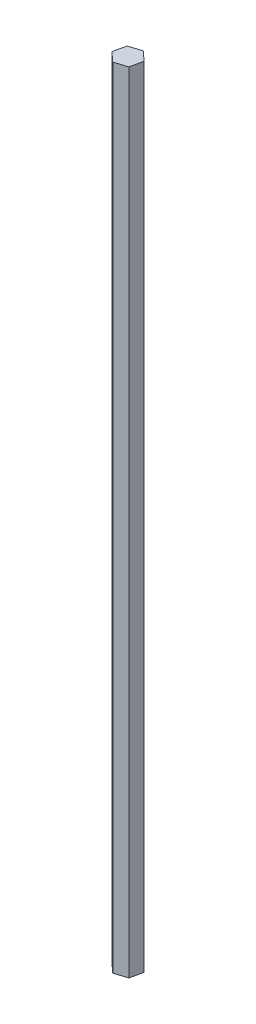
ISO-10303-21;
HEADER;
FILE_DESCRIPTION(('STEP AP214'),'2;1');
FILE_NAME('part.step','',(''),(''),'','','');
FILE_SCHEMA(('AUTOMOTIVE_DESIGN { 1 0 10303 214 1 1 1 1 }'));
ENDSEC;
DATA;
#1=APPLICATION_CONTEXT('core data for automotive mechanical design processes');
#2=APPLICATION_PROTOCOL_DEFINITION('international standard','automotive_design',2000,#1);
#3=PRODUCT_CONTEXT('',#1,'mechanical');
#4=PRODUCT('Part','Part','',(#3));
#5=PRODUCT_RELATED_PRODUCT_CATEGORY('part','',(#4));
#6=PRODUCT_DEFINITION_FORMATION('','',#4);
#7=PRODUCT_DEFINITION_CONTEXT('part definition',#1,'design');
#8=PRODUCT_DEFINITION('design','',#6,#7);
#9=PRODUCT_DEFINITION_SHAPE('','',#8);
#10=(LENGTH_UNIT() NAMED_UNIT(*) SI_UNIT(.MILLI.,.METRE.));
#11=(NAMED_UNIT(*) PLANE_ANGLE_UNIT() SI_UNIT($,.RADIAN.));
#12=(NAMED_UNIT(*) SI_UNIT($,.STERADIAN.) SOLID_ANGLE_UNIT());
#13=UNCERTAINTY_MEASURE_WITH_UNIT(LENGTH_MEASURE(1.E-05),#10,'distance_accuracy_value','');
#14=(GEOMETRIC_REPRESENTATION_CONTEXT(3) GLOBAL_UNCERTAINTY_ASSIGNED_CONTEXT((#13)) GLOBAL_UNIT_ASSIGNED_CONTEXT((#10,
#11,#12)) REPRESENTATION_CONTEXT('',''));
#15=CARTESIAN_POINT('',(0.,0.,0.));
#16=DIRECTION('',(0.,0.,1.));
#17=DIRECTION('',(1.,0.,0.));
#18=AXIS2_PLACEMENT_3D('',#15,#16,#17);
#19=CARTESIAN_POINT('',(-0.61182187926995,177.8,2.82117126764399));
#20=DIRECTION('',(-0.305094633460301,0.,-0.952322038300976));
#21=DIRECTION('',(-0.952322038300976,0.,0.305094633460301));
#22=AXIS2_PLACEMENT_3D('',#19,#20,#21);
#23=PLANE('',#22);
#24=DIRECTION('',(0.952322038300976,0.,-0.305094633460301));
#25=VECTOR('',#24,1.);
#26=CARTESIAN_POINT('',(-0.61182187926995,0.,2.82117126764399));
#27=LINE('',#26,#25);
#28=CARTESIAN_POINT('',(-0.61182187926995,0.,2.82117126764399));
#29=VERTEX_POINT('',#28);
#30=CARTESIAN_POINT('',(2.13729504657146,0.,1.94043892386091));
#31=VERTEX_POINT('',#30);
#32=EDGE_CURVE('E128',#29,#31,#27,.T.);
#33=ORIENTED_EDGE('',*,*,#32,.T.);
#34=DIRECTION('',(0.,-1.,0.));
#35=VECTOR('',#34,1.);
#36=CARTESIAN_POINT('',(2.13729504657146,177.8,1.94043892386091));
#37=LINE('',#36,#35);
#38=CARTESIAN_POINT('',(2.13729504657146,177.8,1.94043892386091));
#39=VERTEX_POINT('',#38);
#40=EDGE_CURVE('E11',#39,#31,#37,.T.);
#41=ORIENTED_EDGE('',*,*,#40,.F.);
#42=DIRECTION('',(0.952322038300976,0.,-0.305094633460301));
#43=VECTOR('',#42,1.);
#44=CARTESIAN_POINT('',(-0.61182187926995,177.8,2.82117126764399));
#45=LINE('',#44,#43);
#46=CARTESIAN_POINT('',(-0.61182187926995,177.8,2.82117126764399));
#47=VERTEX_POINT('',#46);
#48=EDGE_CURVE('E144',#47,#39,#45,.T.);
#49=ORIENTED_EDGE('',*,*,#48,.F.);
#50=DIRECTION('',(0.,-1.,0.));
#51=VECTOR('',#50,1.);
#52=CARTESIAN_POINT('',(-0.61182187926995,177.8,2.82117126764399));
#53=LINE('',#52,#51);
#54=EDGE_CURVE('E124',#47,#29,#53,.T.);
#55=ORIENTED_EDGE('',*,*,#54,.T.);
#56=EDGE_LOOP('',(#33,#41,#49,#55));
#57=FACE_BOUND('',#56,.T.);
#58=ADVANCED_FACE('F39',(#57),#23,.F.);
#59=CARTESIAN_POINT('',(2.13729504657146,177.8,1.94043892386091));
#60=DIRECTION('',(-0.977282394482572,0.,-0.211941316015566));
#61=DIRECTION('',(-0.211941316015566,0.,0.977282394482572));
#62=AXIS2_PLACEMENT_3D('',#59,#60,#61);
#63=PLANE('',#62);
#64=DIRECTION('',(0.211941316015566,0.,-0.977282394482572));
#65=VECTOR('',#64,1.);
#66=CARTESIAN_POINT('',(2.13729504657146,0.,1.94043892386091));
#67=LINE('',#66,#65);
#68=CARTESIAN_POINT('',(2.74911692584142,0.,-0.880732343783076));
#69=VERTEX_POINT('',#68);
#70=EDGE_CURVE('E132',#31,#69,#67,.T.);
#71=ORIENTED_EDGE('',*,*,#70,.T.);
#72=DIRECTION('',(0.,-1.,0.));
#73=VECTOR('',#72,1.);
#74=CARTESIAN_POINT('',(2.74911692584142,177.8,-0.880732343783076));
#75=LINE('',#74,#73);
#76=CARTESIAN_POINT('',(2.74911692584142,177.8,-0.880732343783076));
#77=VERTEX_POINT('',#76);
#78=EDGE_CURVE('E48',#77,#69,#75,.T.);
#79=ORIENTED_EDGE('',*,*,#78,.F.);
#80=DIRECTION('',(0.211941316015566,0.,-0.977282394482572));
#81=VECTOR('',#80,1.);
#82=CARTESIAN_POINT('',(2.13729504657146,177.8,1.94043892386091));
#83=LINE('',#82,#81);
#84=EDGE_CURVE('E93',#39,#77,#83,.T.);
#85=ORIENTED_EDGE('',*,*,#84,.F.);
#86=ORIENTED_EDGE('',*,*,#40,.T.);
#87=EDGE_LOOP('',(#71,#79,#85,#86));
#88=FACE_BOUND('',#87,.T.);
#89=ADVANCED_FACE('F172',(#88),#63,.F.);
#90=CARTESIAN_POINT('',(2.74911692584142,177.8,-0.880732343783076));
#91=DIRECTION('',(-0.672187761022271,0.,0.74038072228541));
#92=DIRECTION('',(0.74038072228541,0.,0.672187761022271));
#93=AXIS2_PLACEMENT_3D('',#90,#91,#92);
#94=PLANE('',#93);
#95=DIRECTION('',(-0.74038072228541,0.,-0.672187761022271));
#96=VECTOR('',#95,1.);
#97=CARTESIAN_POINT('',(2.74911692584142,0.,-0.880732343783076));
#98=LINE('',#97,#96);
#99=CARTESIAN_POINT('',(0.611821879269952,0.,-2.82117126764399));
#100=VERTEX_POINT('',#99);
#101=EDGE_CURVE('E135',#69,#100,#98,.T.);
#102=ORIENTED_EDGE('',*,*,#101,.T.);
#103=DIRECTION('',(0.,-1.,0.));
#104=VECTOR('',#103,1.);
#105=CARTESIAN_POINT('',(0.611821879269952,177.8,-2.82117126764399));
#106=LINE('',#105,#104);
#107=CARTESIAN_POINT('',(0.611821879269952,177.8,-2.82117126764399));
#108=VERTEX_POINT('',#107);
#109=EDGE_CURVE('E117',#108,#100,#106,.T.);
#110=ORIENTED_EDGE('',*,*,#109,.F.);
#111=DIRECTION('',(-0.74038072228541,0.,-0.672187761022271));
#112=VECTOR('',#111,1.);
#113=CARTESIAN_POINT('',(2.74911692584142,177.8,-0.880732343783076));
#114=LINE('',#113,#112);
#115=EDGE_CURVE('E106',#77,#108,#114,.T.);
#116=ORIENTED_EDGE('',*,*,#115,.F.);
#117=ORIENTED_EDGE('',*,*,#78,.T.);
#118=EDGE_LOOP('',(#102,#110,#116,#117));
#119=FACE_BOUND('',#118,.T.);
#120=ADVANCED_FACE('F154',(#119),#94,.F.);
#121=CARTESIAN_POINT('',(0.611821879269952,177.8,-2.82117126764399));
#122=DIRECTION('',(0.305094633460301,0.,0.952322038300975));
#123=DIRECTION('',(0.952322038300976,0.,-0.305094633460301));
#124=AXIS2_PLACEMENT_3D('',#121,#122,#123);
#125=PLANE('',#124);
#126=DIRECTION('',(-0.952322038300976,0.,0.305094633460301));
#127=VECTOR('',#126,1.);
#128=CARTESIAN_POINT('',(0.611821879269952,0.,-2.82117126764399));
#129=LINE('',#128,#127);
#130=CARTESIAN_POINT('',(-2.13729504657146,0.,-1.94043892386091));
#131=VERTEX_POINT('',#130);
#132=EDGE_CURVE('E115',#100,#131,#129,.T.);
#133=ORIENTED_EDGE('',*,*,#132,.T.);
#134=DIRECTION('',(0.,-1.,0.));
#135=VECTOR('',#134,1.);
#136=CARTESIAN_POINT('',(-2.13729504657146,177.8,-1.94043892386091));
#137=LINE('',#136,#135);
#138=CARTESIAN_POINT('',(-2.13729504657146,177.8,-1.94043892386091));
#139=VERTEX_POINT('',#138);
#140=EDGE_CURVE('E112',#139,#131,#137,.T.);
#141=ORIENTED_EDGE('',*,*,#140,.F.);
#142=DIRECTION('',(-0.952322038300976,0.,0.305094633460301));
#143=VECTOR('',#142,1.);
#144=CARTESIAN_POINT('',(0.611821879269952,177.8,-2.82117126764399));
#145=LINE('',#144,#143);
#146=EDGE_CURVE('E100',#108,#139,#145,.T.);
#147=ORIENTED_EDGE('',*,*,#146,.F.);
#148=ORIENTED_EDGE('',*,*,#109,.T.);
#149=EDGE_LOOP('',(#133,#141,#147,#148));
#150=FACE_BOUND('',#149,.T.);
#151=ADVANCED_FACE('F113',(#150),#125,.F.);
#152=CARTESIAN_POINT('',(-2.13729504657146,177.8,-1.94043892386091));
#153=DIRECTION('',(0.977282394482572,0.,0.211941316015565));
#154=DIRECTION('',(0.211941316015565,0.,-0.977282394482572));
#155=AXIS2_PLACEMENT_3D('',#152,#153,#154);
#156=PLANE('',#155);
#157=DIRECTION('',(-0.211941316015565,0.,0.977282394482572));
#158=VECTOR('',#157,1.);
#159=CARTESIAN_POINT('',(-2.13729504657146,0.,-1.94043892386091));
#160=LINE('',#159,#158);
#161=CARTESIAN_POINT('',(-2.74911692584141,0.,0.88073234378308));
#162=VERTEX_POINT('',#161);
#163=EDGE_CURVE('E79',#131,#162,#160,.T.);
#164=ORIENTED_EDGE('',*,*,#163,.T.);
#165=DIRECTION('',(0.,-1.,0.));
#166=VECTOR('',#165,1.);
#167=CARTESIAN_POINT('',(-2.74911692584141,177.8,0.88073234378308));
#168=LINE('',#167,#166);
#169=CARTESIAN_POINT('',(-2.74911692584141,177.8,0.88073234378308));
#170=VERTEX_POINT('',#169);
#171=EDGE_CURVE('E118',#170,#162,#168,.T.);
#172=ORIENTED_EDGE('',*,*,#171,.F.);
#173=DIRECTION('',(-0.211941316015565,0.,0.977282394482572));
#174=VECTOR('',#173,1.);
#175=CARTESIAN_POINT('',(-2.13729504657146,177.8,-1.94043892386091));
#176=LINE('',#175,#174);
#177=EDGE_CURVE('E104',#139,#170,#176,.T.);
#178=ORIENTED_EDGE('',*,*,#177,.F.);
#179=ORIENTED_EDGE('',*,*,#140,.T.);
#180=EDGE_LOOP('',(#164,#172,#178,#179));
#181=FACE_BOUND('',#180,.T.);
#182=ADVANCED_FACE('F120',(#181),#156,.F.);
#183=CARTESIAN_POINT('',(-2.74911692584141,177.8,0.88073234378308));
#184=DIRECTION('',(0.672187761022271,0.,-0.74038072228541));
#185=DIRECTION('',(-0.740380722285411,0.,-0.672187761022271));
#186=AXIS2_PLACEMENT_3D('',#183,#184,#185);
#187=PLANE('',#186);
#188=DIRECTION('',(0.740380722285411,0.,0.672187761022271));
#189=VECTOR('',#188,1.);
#190=CARTESIAN_POINT('',(-2.74911692584141,0.,0.88073234378308));
#191=LINE('',#190,#189);
#192=EDGE_CURVE('E85',#162,#29,#191,.T.);
#193=ORIENTED_EDGE('',*,*,#192,.T.);
#194=ORIENTED_EDGE('',*,*,#54,.F.);
#195=DIRECTION('',(0.740380722285411,0.,0.672187761022271));
#196=VECTOR('',#195,1.);
#197=CARTESIAN_POINT('',(-2.74911692584141,177.8,0.88073234378308));
#198=LINE('',#197,#196);
#199=EDGE_CURVE('E56',#170,#47,#198,.T.);
#200=ORIENTED_EDGE('',*,*,#199,.F.);
#201=ORIENTED_EDGE('',*,*,#171,.T.);
#202=EDGE_LOOP('',(#193,#194,#200,#201));
#203=FACE_BOUND('',#202,.T.);
#204=ADVANCED_FACE('F161',(#203),#187,.F.);
#205=CARTESIAN_POINT('',(0.,177.8,0.));
#206=DIRECTION('',(0.,1.,0.));
#207=DIRECTION('',(0.,0.,1.));
#208=AXIS2_PLACEMENT_3D('',#205,#206,#207);
#209=PLANE('',#208);
#210=ORIENTED_EDGE('',*,*,#48,.T.);
#211=ORIENTED_EDGE('',*,*,#84,.T.);
#212=ORIENTED_EDGE('',*,*,#115,.T.);
#213=ORIENTED_EDGE('',*,*,#146,.T.);
#214=ORIENTED_EDGE('',*,*,#177,.T.);
#215=ORIENTED_EDGE('',*,*,#199,.T.);
#216=EDGE_LOOP('',(#210,#211,#212,#213,#214,#215));
#217=FACE_BOUND('',#216,.T.);
#218=ADVANCED_FACE('F102',(#217),#209,.T.);
#219=CARTESIAN_POINT('',(0.,0.,0.));
#220=DIRECTION('',(0.,1.,0.));
#221=DIRECTION('',(0.,0.,1.));
#222=AXIS2_PLACEMENT_3D('',#219,#220,#221);
#223=PLANE('',#222);
#224=ORIENTED_EDGE('',*,*,#32,.F.);
#225=ORIENTED_EDGE('',*,*,#192,.F.);
#226=ORIENTED_EDGE('',*,*,#163,.F.);
#227=ORIENTED_EDGE('',*,*,#132,.F.);
#228=ORIENTED_EDGE('',*,*,#101,.F.);
#229=ORIENTED_EDGE('',*,*,#70,.F.);
#230=EDGE_LOOP('',(#224,#225,#226,#227,#228,#229));
#231=FACE_BOUND('',#230,.T.);
#232=ADVANCED_FACE('F157',(#231),#223,.F.);
#233=CLOSED_SHELL('',(#58,#89,#120,#151,#182,#204,#218,#232));
#234=MANIFOLD_SOLID_BREP('B2',#233);
#235=ADVANCED_BREP_SHAPE_REPRESENTATION('',(#18,#234),#14);
#236=SHAPE_DEFINITION_REPRESENTATION(#9,#235);
ENDSEC;
END-ISO-10303-21;
